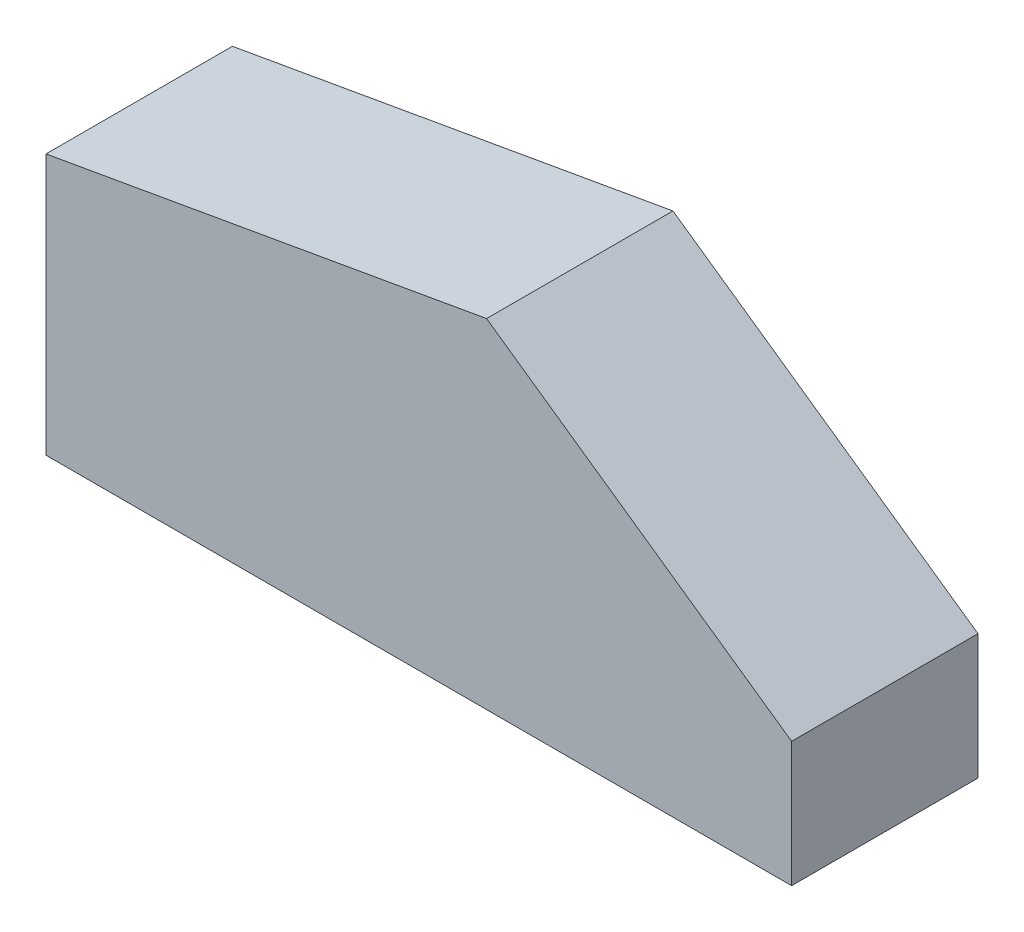
ISO-10303-21;
HEADER;
FILE_DESCRIPTION(('STEP AP214'),'2;1');
FILE_NAME('part.step','',(''),(''),'','','');
FILE_SCHEMA(('AUTOMOTIVE_DESIGN { 1 0 10303 214 1 1 1 1 }'));
ENDSEC;
DATA;
#1=APPLICATION_CONTEXT('core data for automotive mechanical design processes');
#2=APPLICATION_PROTOCOL_DEFINITION('international standard','automotive_design',2000,#1);
#3=PRODUCT_CONTEXT('',#1,'mechanical');
#4=PRODUCT('Part','Part','',(#3));
#5=PRODUCT_RELATED_PRODUCT_CATEGORY('part','',(#4));
#6=PRODUCT_DEFINITION_FORMATION('','',#4);
#7=PRODUCT_DEFINITION_CONTEXT('part definition',#1,'design');
#8=PRODUCT_DEFINITION('design','',#6,#7);
#9=PRODUCT_DEFINITION_SHAPE('','',#8);
#10=(LENGTH_UNIT() NAMED_UNIT(*) SI_UNIT(.MILLI.,.METRE.));
#11=(NAMED_UNIT(*) PLANE_ANGLE_UNIT() SI_UNIT($,.RADIAN.));
#12=(NAMED_UNIT(*) SI_UNIT($,.STERADIAN.) SOLID_ANGLE_UNIT());
#13=UNCERTAINTY_MEASURE_WITH_UNIT(LENGTH_MEASURE(1.E-05),#10,'distance_accuracy_value','');
#14=(GEOMETRIC_REPRESENTATION_CONTEXT(3) GLOBAL_UNCERTAINTY_ASSIGNED_CONTEXT((#13)) GLOBAL_UNIT_ASSIGNED_CONTEXT((#10,
#11,#12)) REPRESENTATION_CONTEXT('',''));
#15=CARTESIAN_POINT('',(0.,0.,0.));
#16=DIRECTION('',(0.,0.,1.));
#17=DIRECTION('',(1.,0.,0.));
#18=AXIS2_PLACEMENT_3D('',#15,#16,#17);
#19=CARTESIAN_POINT('',(100.,16.7723255798352,25.));
#20=DIRECTION('',(-0.57357643635105,-0.819152044288989,0.));
#21=DIRECTION('',(0.819152044288989,-0.57357643635105,0.));
#22=AXIS2_PLACEMENT_3D('',#19,#20,#21);
#23=PLANE('',#22);
#24=DIRECTION('',(-0.819152044288989,0.57357643635105,0.));
#25=VECTOR('',#24,1.);
#26=CARTESIAN_POINT('',(100.,16.7723255798352,0.));
#27=LINE('',#26,#25);
#28=CARTESIAN_POINT('',(100.,16.7723255798352,0.));
#29=VERTEX_POINT('',#28);
#30=CARTESIAN_POINT('',(59.0884651807325,45.4188906600156,0.));
#31=VERTEX_POINT('',#30);
#32=EDGE_CURVE('E124',#29,#31,#27,.T.);
#33=ORIENTED_EDGE('',*,*,#32,.T.);
#34=DIRECTION('',(0.,0.,-1.));
#35=VECTOR('',#34,1.);
#36=CARTESIAN_POINT('',(59.0884651807325,45.4188906600156,25.));
#37=LINE('',#36,#35);
#38=CARTESIAN_POINT('',(59.0884651807325,45.4188906600156,25.));
#39=VERTEX_POINT('',#38);
#40=EDGE_CURVE('E11',#39,#31,#37,.T.);
#41=ORIENTED_EDGE('',*,*,#40,.F.);
#42=DIRECTION('',(-0.819152044288989,0.57357643635105,0.));
#43=VECTOR('',#42,1.);
#44=CARTESIAN_POINT('',(100.,16.7723255798352,25.));
#45=LINE('',#44,#43);
#46=CARTESIAN_POINT('',(100.,16.7723255798352,25.));
#47=VERTEX_POINT('',#46);
#48=EDGE_CURVE('E137',#47,#39,#45,.T.);
#49=ORIENTED_EDGE('',*,*,#48,.F.);
#50=DIRECTION('',(0.,0.,-1.));
#51=VECTOR('',#50,1.);
#52=CARTESIAN_POINT('',(100.,16.7723255798352,25.));
#53=LINE('',#52,#51);
#54=EDGE_CURVE('E120',#47,#29,#53,.T.);
#55=ORIENTED_EDGE('',*,*,#54,.T.);
#56=EDGE_LOOP('',(#33,#41,#49,#55));
#57=FACE_BOUND('',#56,.T.);
#58=ADVANCED_FACE('F45',(#57),#23,.F.);
#59=CARTESIAN_POINT('',(59.0884651807325,45.4188906600156,25.));
#60=DIRECTION('',(0.173648177666927,-0.984807753012209,0.));
#61=DIRECTION('',(0.984807753012209,0.173648177666927,0.));
#62=AXIS2_PLACEMENT_3D('',#59,#60,#61);
#63=PLANE('',#62);
#64=DIRECTION('',(-0.984807753012208,-0.173648177666927,0.));
#65=VECTOR('',#64,1.);
#66=CARTESIAN_POINT('',(59.0884651807325,45.4188906600156,0.));
#67=LINE('',#66,#65);
#68=CARTESIAN_POINT('',(0.,35.,0.));
#69=VERTEX_POINT('',#68);
#70=EDGE_CURVE('E128',#31,#69,#67,.T.);
#71=ORIENTED_EDGE('',*,*,#70,.T.);
#72=DIRECTION('',(0.,0.,-1.));
#73=VECTOR('',#72,1.);
#74=CARTESIAN_POINT('',(0.,35.,25.));
#75=LINE('',#74,#73);
#76=CARTESIAN_POINT('',(0.,35.,25.));
#77=VERTEX_POINT('',#76);
#78=EDGE_CURVE('E54',#77,#69,#75,.T.);
#79=ORIENTED_EDGE('',*,*,#78,.F.);
#80=DIRECTION('',(-0.984807753012208,-0.173648177666927,0.));
#81=VECTOR('',#80,1.);
#82=CARTESIAN_POINT('',(59.0884651807325,45.4188906600156,25.));
#83=LINE('',#82,#81);
#84=EDGE_CURVE('E96',#39,#77,#83,.T.);
#85=ORIENTED_EDGE('',*,*,#84,.F.);
#86=ORIENTED_EDGE('',*,*,#40,.T.);
#87=EDGE_LOOP('',(#71,#79,#85,#86));
#88=FACE_BOUND('',#87,.T.);
#89=ADVANCED_FACE('F159',(#88),#63,.F.);
#90=CARTESIAN_POINT('',(0.,35.,25.));
#91=DIRECTION('',(1.,0.,0.));
#92=DIRECTION('',(0.,0.,-1.));
#93=AXIS2_PLACEMENT_3D('',#90,#91,#92);
#94=PLANE('',#93);
#95=DIRECTION('',(0.,-1.,0.));
#96=VECTOR('',#95,1.);
#97=CARTESIAN_POINT('',(0.,35.,0.));
#98=LINE('',#97,#96);
#99=CARTESIAN_POINT('',(0.,0.,0.));
#100=VERTEX_POINT('',#99);
#101=EDGE_CURVE('E112',#69,#100,#98,.T.);
#102=ORIENTED_EDGE('',*,*,#101,.T.);
#103=DIRECTION('',(0.,0.,-1.));
#104=VECTOR('',#103,1.);
#105=CARTESIAN_POINT('',(0.,0.,25.));
#106=LINE('',#105,#104);
#107=CARTESIAN_POINT('',(0.,0.,25.));
#108=VERTEX_POINT('',#107);
#109=EDGE_CURVE('E109',#108,#100,#106,.T.);
#110=ORIENTED_EDGE('',*,*,#109,.F.);
#111=DIRECTION('',(0.,-1.,0.));
#112=VECTOR('',#111,1.);
#113=CARTESIAN_POINT('',(0.,35.,25.));
#114=LINE('',#113,#112);
#115=EDGE_CURVE('E100',#77,#108,#114,.T.);
#116=ORIENTED_EDGE('',*,*,#115,.F.);
#117=ORIENTED_EDGE('',*,*,#78,.T.);
#118=EDGE_LOOP('',(#102,#110,#116,#117));
#119=FACE_BOUND('',#118,.T.);
#120=ADVANCED_FACE('F110',(#119),#94,.F.);
#121=CARTESIAN_POINT('',(0.,0.,25.));
#122=DIRECTION('',(0.,1.,0.));
#123=DIRECTION('',(0.,0.,1.));
#124=AXIS2_PLACEMENT_3D('',#121,#122,#123);
#125=PLANE('',#124);
#126=DIRECTION('',(1.,0.,0.));
#127=VECTOR('',#126,1.);
#128=CARTESIAN_POINT('',(0.,0.,0.));
#129=LINE('',#128,#127);
#130=CARTESIAN_POINT('',(100.,0.,0.));
#131=VERTEX_POINT('',#130);
#132=EDGE_CURVE('E82',#100,#131,#129,.T.);
#133=ORIENTED_EDGE('',*,*,#132,.T.);
#134=DIRECTION('',(0.,0.,-1.));
#135=VECTOR('',#134,1.);
#136=CARTESIAN_POINT('',(100.,0.,25.));
#137=LINE('',#136,#135);
#138=CARTESIAN_POINT('',(100.,0.,25.));
#139=VERTEX_POINT('',#138);
#140=EDGE_CURVE('E114',#139,#131,#137,.T.);
#141=ORIENTED_EDGE('',*,*,#140,.F.);
#142=DIRECTION('',(1.,0.,0.));
#143=VECTOR('',#142,1.);
#144=CARTESIAN_POINT('',(0.,0.,25.));
#145=LINE('',#144,#143);
#146=EDGE_CURVE('E104',#108,#139,#145,.T.);
#147=ORIENTED_EDGE('',*,*,#146,.F.);
#148=ORIENTED_EDGE('',*,*,#109,.T.);
#149=EDGE_LOOP('',(#133,#141,#147,#148));
#150=FACE_BOUND('',#149,.T.);
#151=ADVANCED_FACE('F116',(#150),#125,.F.);
#152=CARTESIAN_POINT('',(100.,0.,25.));
#153=DIRECTION('',(-1.,0.,0.));
#154=DIRECTION('',(0.,0.,1.));
#155=AXIS2_PLACEMENT_3D('',#152,#153,#154);
#156=PLANE('',#155);
#157=DIRECTION('',(0.,1.,0.));
#158=VECTOR('',#157,1.);
#159=CARTESIAN_POINT('',(100.,0.,0.));
#160=LINE('',#159,#158);
#161=EDGE_CURVE('E88',#131,#29,#160,.T.);
#162=ORIENTED_EDGE('',*,*,#161,.T.);
#163=ORIENTED_EDGE('',*,*,#54,.F.);
#164=DIRECTION('',(0.,1.,0.));
#165=VECTOR('',#164,1.);
#166=CARTESIAN_POINT('',(100.,0.,25.));
#167=LINE('',#166,#165);
#168=EDGE_CURVE('E62',#139,#47,#167,.T.);
#169=ORIENTED_EDGE('',*,*,#168,.F.);
#170=ORIENTED_EDGE('',*,*,#140,.T.);
#171=EDGE_LOOP('',(#162,#163,#169,#170));
#172=FACE_BOUND('',#171,.T.);
#173=ADVANCED_FACE('F148',(#172),#156,.F.);
#174=CARTESIAN_POINT('',(0.,0.,25.));
#175=DIRECTION('',(0.,0.,1.));
#176=DIRECTION('',(1.,0.,0.));
#177=AXIS2_PLACEMENT_3D('',#174,#175,#176);
#178=PLANE('',#177);
#179=ORIENTED_EDGE('',*,*,#48,.T.);
#180=ORIENTED_EDGE('',*,*,#84,.T.);
#181=ORIENTED_EDGE('',*,*,#115,.T.);
#182=ORIENTED_EDGE('',*,*,#146,.T.);
#183=ORIENTED_EDGE('',*,*,#168,.T.);
#184=EDGE_LOOP('',(#179,#180,#181,#182,#183));
#185=FACE_BOUND('',#184,.T.);
#186=ADVANCED_FACE('F102',(#185),#178,.T.);
#187=CARTESIAN_POINT('',(0.,0.,0.));
#188=DIRECTION('',(0.,0.,1.));
#189=DIRECTION('',(1.,0.,0.));
#190=AXIS2_PLACEMENT_3D('',#187,#188,#189);
#191=PLANE('',#190);
#192=ORIENTED_EDGE('',*,*,#32,.F.);
#193=ORIENTED_EDGE('',*,*,#161,.F.);
#194=ORIENTED_EDGE('',*,*,#132,.F.);
#195=ORIENTED_EDGE('',*,*,#101,.F.);
#196=ORIENTED_EDGE('',*,*,#70,.F.);
#197=EDGE_LOOP('',(#192,#193,#194,#195,#196));
#198=FACE_BOUND('',#197,.T.);
#199=ADVANCED_FACE('F144',(#198),#191,.F.);
#200=CLOSED_SHELL('',(#58,#89,#120,#151,#173,#186,#199));
#201=MANIFOLD_SOLID_BREP('B2',#200);
#202=ADVANCED_BREP_SHAPE_REPRESENTATION('',(#18,#201),#14);
#203=SHAPE_DEFINITION_REPRESENTATION(#9,#202);
ENDSEC;
END-ISO-10303-21;
